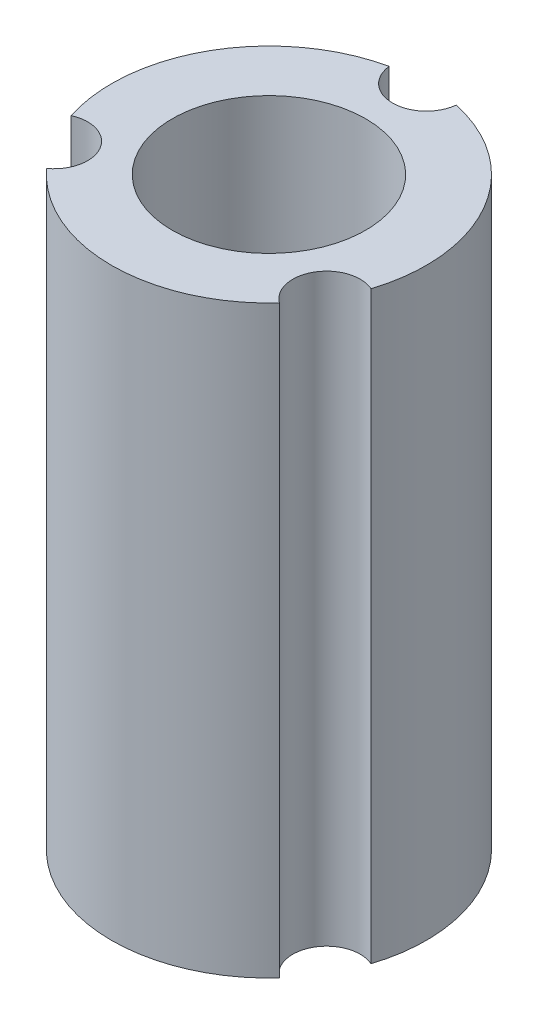
ISO-10303-21;
HEADER;
FILE_DESCRIPTION(('STEP AP214'),'2;1');
FILE_NAME('part.step','',(''),(''),'','','');
FILE_SCHEMA(('AUTOMOTIVE_DESIGN { 1 0 10303 214 1 1 1 1 }'));
ENDSEC;
DATA;
#1=APPLICATION_CONTEXT('core data for automotive mechanical design processes');
#2=APPLICATION_PROTOCOL_DEFINITION('international standard','automotive_design',2000,#1);
#3=PRODUCT_CONTEXT('',#1,'mechanical');
#4=PRODUCT('Part','Part','',(#3));
#5=PRODUCT_RELATED_PRODUCT_CATEGORY('part','',(#4));
#6=PRODUCT_DEFINITION_FORMATION('','',#4);
#7=PRODUCT_DEFINITION_CONTEXT('part definition',#1,'design');
#8=PRODUCT_DEFINITION('design','',#6,#7);
#9=PRODUCT_DEFINITION_SHAPE('','',#8);
#10=(LENGTH_UNIT() NAMED_UNIT(*) SI_UNIT(.MILLI.,.METRE.));
#11=(NAMED_UNIT(*) PLANE_ANGLE_UNIT() SI_UNIT($,.RADIAN.));
#12=(NAMED_UNIT(*) SI_UNIT($,.STERADIAN.) SOLID_ANGLE_UNIT());
#13=UNCERTAINTY_MEASURE_WITH_UNIT(LENGTH_MEASURE(1.E-05),#10,'distance_accuracy_value','');
#14=(GEOMETRIC_REPRESENTATION_CONTEXT(3) GLOBAL_UNCERTAINTY_ASSIGNED_CONTEXT((#13)) GLOBAL_UNIT_ASSIGNED_CONTEXT((#10,
#11,#12)) REPRESENTATION_CONTEXT('',''));
#15=CARTESIAN_POINT('',(0.,0.,0.));
#16=DIRECTION('',(0.,0.,1.));
#17=DIRECTION('',(1.,0.,0.));
#18=AXIS2_PLACEMENT_3D('',#15,#16,#17);
#19=CARTESIAN_POINT('',(0.,0.,0.));
#20=DIRECTION('',(0.,-1.,0.));
#21=DIRECTION('',(0.,0.,-1.));
#22=AXIS2_PLACEMENT_3D('',#19,#20,#21);
#23=CYLINDRICAL_SURFACE('',#22,3.);
#24=CARTESIAN_POINT('',(0.,6.,0.));
#25=DIRECTION('',(0.,-1.,0.));
#26=DIRECTION('',(0.,0.,-1.));
#27=AXIS2_PLACEMENT_3D('',#24,#25,#26);
#28=CIRCLE('',#27,3.);
#29=CARTESIAN_POINT('',(0.,6.,-3.));
#30=VERTEX_POINT('',#29);
#31=EDGE_CURVE('P0_E21',#30,#30,#28,.T.);
#32=ORIENTED_EDGE('',*,*,#31,.T.);
#33=EDGE_LOOP('',(#32));
#34=FACE_BOUND('',#33,.T.);
#35=CARTESIAN_POINT('',(0.,0.,0.));
#36=DIRECTION('',(0.,-1.,0.));
#37=DIRECTION('',(0.,0.,-1.));
#38=AXIS2_PLACEMENT_3D('',#35,#36,#37);
#39=CIRCLE('',#38,3.);
#40=CARTESIAN_POINT('',(0.,0.,-3.));
#41=VERTEX_POINT('',#40);
#42=EDGE_CURVE('P0_E11',#41,#41,#39,.F.);
#43=ORIENTED_EDGE('',*,*,#42,.T.);
#44=EDGE_LOOP('',(#43));
#45=FACE_BOUND('',#44,.T.);
#46=ADVANCED_FACE('P0_F17',(#34,#45),#23,.T.);
#47=CARTESIAN_POINT('',(0.,6.,0.));
#48=DIRECTION('',(0.,-1.,0.));
#49=DIRECTION('',(0.,0.,-1.));
#50=AXIS2_PLACEMENT_3D('',#47,#48,#49);
#51=PLANE('',#50);
#52=CARTESIAN_POINT('',(-2.625,6.,0.));
#53=CARTESIAN_POINT('',(-2.62479757037723,6.,0.500945811398764));
#54=CARTESIAN_POINT('',(-2.44069429028888,6.,0.966248612599916));
#55=CARTESIAN_POINT('',(-2.240871294793,6.,1.47128143713196));
#56=CARTESIAN_POINT('',(-1.85615530061469,6.,1.85615530061469));
#57=CARTESIAN_POINT('',(-1.47218434385404,6.,2.24028382095152));
#58=CARTESIAN_POINT('',(-0.966248612599916,6.,2.44069429028888));
#59=CARTESIAN_POINT('',(-0.501224965872504,6.,2.62489872879058));
#60=CARTESIAN_POINT('',(0.,6.,2.625));
#61=CARTESIAN_POINT('',(0.500178771877251,6.,2.62510105982863));
#62=CARTESIAN_POINT('',(0.966248612599916,6.,2.44069429028888));
#63=CARTESIAN_POINT('',(1.47128143713232,6.,2.24087129479286));
#64=CARTESIAN_POINT('',(1.85615530061469,6.,1.85615530061469));
#65=CARTESIAN_POINT('',(2.24028382095097,6.,1.47218434385437));
#66=CARTESIAN_POINT('',(2.44069429028888,6.,0.966248612599916));
#67=CARTESIAN_POINT('',(2.62479735415639,6.,0.501480885885279));
#68=CARTESIAN_POINT('',(2.625,6.,0.));
#69=B_SPLINE_CURVE_WITH_KNOTS('',2,(#52,#53,#54,#55,#56,#57,#58,#59,#60,#61,#62,#63,#64,#65,#66,
#67,#68),.UNSPECIFIED.,.F.,.F.,(3,2,2,2,2,2,2,2,3),(0.,0.125,0.25,0.375,0.5,0.625,0.75,0.875,
1.),.UNSPECIFIED.);
#70=CARTESIAN_POINT('',(-2.625,6.,0.));
#71=VERTEX_POINT('',#70);
#72=CARTESIAN_POINT('',(2.625,6.,0.));
#73=VERTEX_POINT('',#72);
#74=EDGE_CURVE('P0_E29',#71,#73,#69,.T.);
#75=ORIENTED_EDGE('',*,*,#74,.F.);
#76=CARTESIAN_POINT('',(2.625,6.,0.));
#77=CARTESIAN_POINT('',(2.62479757037723,6.,-0.500945811398764));
#78=CARTESIAN_POINT('',(2.44069429028888,6.,-0.966248612599916));
#79=CARTESIAN_POINT('',(2.240871294793,6.,-1.47128143713196));
#80=CARTESIAN_POINT('',(1.85615530061469,6.,-1.85615530061469));
#81=CARTESIAN_POINT('',(1.47218434385404,6.,-2.24028382095152));
#82=CARTESIAN_POINT('',(0.966248612599916,6.,-2.44069429028888));
#83=CARTESIAN_POINT('',(0.501224965872504,6.,-2.62489872879058));
#84=CARTESIAN_POINT('',(0.,6.,-2.625));
#85=CARTESIAN_POINT('',(-0.500178771877251,6.,-2.62510105982863));
#86=CARTESIAN_POINT('',(-0.966248612599916,6.,-2.44069429028888));
#87=CARTESIAN_POINT('',(-1.47128143713232,6.,-2.24087129479286));
#88=CARTESIAN_POINT('',(-1.85615530061469,6.,-1.85615530061469));
#89=CARTESIAN_POINT('',(-2.24028382095097,6.,-1.47218434385437));
#90=CARTESIAN_POINT('',(-2.44069429028888,6.,-0.966248612599916));
#91=CARTESIAN_POINT('',(-2.62479735415639,6.,-0.501480885885279));
#92=CARTESIAN_POINT('',(-2.625,6.,0.));
#93=B_SPLINE_CURVE_WITH_KNOTS('',2,(#76,#77,#78,#79,#80,#81,#82,#83,#84,#85,#86,#87,#88,#89,#90,
#91,#92),.UNSPECIFIED.,.F.,.F.,(3,2,2,2,2,2,2,2,3),(0.,0.125,0.25,0.375,0.5,0.625,0.75,0.875,
1.),.UNSPECIFIED.);
#94=EDGE_CURVE('P0_E34',#73,#71,#93,.T.);
#95=ORIENTED_EDGE('',*,*,#94,.F.);
#96=EDGE_LOOP('',(#75,#95));
#97=FACE_BOUND('',#96,.T.);
#98=ORIENTED_EDGE('',*,*,#31,.F.);
#99=EDGE_LOOP('',(#98));
#100=FACE_BOUND('',#99,.T.);
#101=ADVANCED_FACE('P0_F18',(#97,#100),#51,.F.);
#102=OPEN_SHELL('',(#46,#101));
#103=SHELL_BASED_SURFACE_MODEL('P0_B1',(#102));
#104=CARTESIAN_POINT('',(0.,26.,0.));
#105=DIRECTION('',(0.,1.,0.));
#106=DIRECTION('',(0.,0.,1.));
#107=AXIS2_PLACEMENT_3D('',#104,#105,#106);
#108=CYLINDRICAL_SURFACE('',#107,1.75);
#109=CARTESIAN_POINT('',(0.,6.,0.));
#110=DIRECTION('',(0.,1.,0.));
#111=DIRECTION('',(0.,0.,1.));
#112=AXIS2_PLACEMENT_3D('',#109,#110,#111);
#113=CIRCLE('',#112,1.75);
#114=CARTESIAN_POINT('',(0.,6.,1.75));
#115=VERTEX_POINT('',#114);
#116=EDGE_CURVE('P1_E103',#115,#115,#113,.T.);
#117=ORIENTED_EDGE('',*,*,#116,.F.);
#118=EDGE_LOOP('',(#117));
#119=FACE_BOUND('',#118,.T.);
#120=CARTESIAN_POINT('',(0.,8.5,0.));
#121=DIRECTION('',(0.,1.,0.));
#122=DIRECTION('',(0.,0.,1.));
#123=AXIS2_PLACEMENT_3D('',#120,#121,#122);
#124=CIRCLE('',#123,1.75);
#125=CARTESIAN_POINT('',(0.,8.5,1.75));
#126=VERTEX_POINT('',#125);
#127=EDGE_CURVE('P1_E20',#126,#126,#124,.T.);
#128=ORIENTED_EDGE('',*,*,#127,.T.);
#129=EDGE_LOOP('',(#128));
#130=FACE_BOUND('',#129,.T.);
#131=ADVANCED_FACE('P1_F17',(#119,#130),#108,.F.);
#132=CARTESIAN_POINT('',(0.,8.5,0.));
#133=DIRECTION('',(0.,-1.,0.));
#134=DIRECTION('',(0.,0.,-1.));
#135=AXIS2_PLACEMENT_3D('',#132,#133,#134);
#136=PLANE('',#135);
#137=ORIENTED_EDGE('',*,*,#127,.F.);
#138=EDGE_LOOP('',(#137));
#139=FACE_BOUND('',#138,.T.);
#140=CARTESIAN_POINT('',(0.,8.5,0.));
#141=DIRECTION('',(0.,-1.,0.));
#142=DIRECTION('',(0.,0.,-1.));
#143=AXIS2_PLACEMENT_3D('',#140,#141,#142);
#144=CIRCLE('',#143,4.3);
#145=CARTESIAN_POINT('',(0.,8.5,-4.3));
#146=VERTEX_POINT('',#145);
#147=EDGE_CURVE('P1_E78',#146,#146,#144,.F.);
#148=ORIENTED_EDGE('',*,*,#147,.T.);
#149=EDGE_LOOP('',(#148));
#150=FACE_BOUND('',#149,.T.);
#151=ADVANCED_FACE('P1_F111',(#139,#150),#136,.F.);
#152=CARTESIAN_POINT('',(0.,6.,0.));
#153=DIRECTION('',(0.,-1.,0.));
#154=DIRECTION('',(0.,0.,-1.));
#155=AXIS2_PLACEMENT_3D('',#152,#153,#154);
#156=PLANE('',#155);
#157=ORIENTED_EDGE('',*,*,#116,.T.);
#158=EDGE_LOOP('',(#157));
#159=FACE_BOUND('',#158,.T.);
#160=CARTESIAN_POINT('',(0.,6.,0.));
#161=DIRECTION('',(0.,-1.,0.));
#162=DIRECTION('',(0.,0.,-1.));
#163=AXIS2_PLACEMENT_3D('',#160,#161,#162);
#164=CIRCLE('',#163,2.625);
#165=CARTESIAN_POINT('',(0.,6.,-2.625));
#166=VERTEX_POINT('',#165);
#167=EDGE_CURVE('P1_E77',#166,#166,#164,.T.);
#168=ORIENTED_EDGE('',*,*,#167,.T.);
#169=EDGE_LOOP('',(#168));
#170=FACE_BOUND('',#169,.T.);
#171=ADVANCED_FACE('P1_F114',(#159,#170),#156,.T.);
#172=CARTESIAN_POINT('',(0.,26.,0.));
#173=DIRECTION('',(0.,-1.,0.));
#174=DIRECTION('',(0.,0.,-1.));
#175=AXIS2_PLACEMENT_3D('',#172,#173,#174);
#176=CYLINDRICAL_SURFACE('',#175,4.3);
#177=ORIENTED_EDGE('',*,*,#147,.F.);
#178=EDGE_LOOP('',(#177));
#179=FACE_BOUND('',#178,.T.);
#180=CARTESIAN_POINT('',(0.,26.,0.));
#181=DIRECTION('',(0.,-1.,0.));
#182=DIRECTION('',(0.,0.,-1.));
#183=AXIS2_PLACEMENT_3D('',#180,#181,#182);
#184=CIRCLE('',#183,4.3);
#185=CARTESIAN_POINT('',(0.,26.,-4.3));
#186=VERTEX_POINT('',#185);
#187=EDGE_CURVE('P1_E93',#186,#186,#184,.T.);
#188=ORIENTED_EDGE('',*,*,#187,.F.);
#189=EDGE_LOOP('',(#188));
#190=FACE_BOUND('',#189,.T.);
#191=ADVANCED_FACE('P1_F117',(#179,#190),#176,.F.);
#192=CARTESIAN_POINT('',(6.062177826491,-4.03,3.5));
#193=DIRECTION('',(0.,1.,0.));
#194=DIRECTION('',(0.,0.,1.));
#195=AXIS2_PLACEMENT_3D('',#192,#193,#194);
#196=CYLINDRICAL_SURFACE('',#195,1.5);
#197=DIRECTION('',(0.,1.,0.));
#198=VECTOR('',#197,1.);
#199=CARTESIAN_POINT('',(5.17731244514668,0.,4.71120322691871));
#200=LINE('',#199,#198);
#201=CARTESIAN_POINT('',(5.17731244514667,0.,4.71120322691872));
#202=VERTEX_POINT('',#201);
#203=CARTESIAN_POINT('',(5.17731244514667,26.,4.71120322691872));
#204=VERTEX_POINT('',#203);
#205=EDGE_CURVE('P1_E89',#202,#204,#200,.T.);
#206=ORIENTED_EDGE('',*,*,#205,.F.);
#207=CARTESIAN_POINT('',(6.062177826491,0.,3.5));
#208=DIRECTION('',(0.,1.,0.));
#209=DIRECTION('',(0.,0.,1.));
#210=AXIS2_PLACEMENT_3D('',#207,#208,#209);
#211=CIRCLE('',#210,1.5);
#212=CARTESIAN_POINT('',(6.66867789947615,0.,2.12808248736705));
#213=VERTEX_POINT('',#212);
#214=EDGE_CURVE('P1_E74',#202,#213,#211,.F.);
#215=ORIENTED_EDGE('',*,*,#214,.T.);
#216=DIRECTION('',(0.,1.,0.));
#217=VECTOR('',#216,1.);
#218=CARTESIAN_POINT('',(6.66867789947615,0.,2.12808248736705));
#219=LINE('',#218,#217);
#220=CARTESIAN_POINT('',(6.66867789947615,26.,2.12808248736704));
#221=VERTEX_POINT('',#220);
#222=EDGE_CURVE('P1_E67',#221,#213,#219,.F.);
#223=ORIENTED_EDGE('',*,*,#222,.F.);
#224=CARTESIAN_POINT('',(6.062177826491,26.,3.5));
#225=DIRECTION('',(0.,1.,0.));
#226=DIRECTION('',(0.,0.,1.));
#227=AXIS2_PLACEMENT_3D('',#224,#225,#226);
#228=CIRCLE('',#227,1.5);
#229=EDGE_CURVE('P1_E71',#204,#221,#228,.F.);
#230=ORIENTED_EDGE('',*,*,#229,.F.);
#231=EDGE_LOOP('',(#206,#215,#223,#230));
#232=FACE_BOUND('',#231,.T.);
#233=ADVANCED_FACE('P1_F69',(#232),#196,.F.);
#234=CARTESIAN_POINT('',(0.,0.,0.));
#235=DIRECTION('',(0.,1.,0.));
#236=DIRECTION('',(0.,0.,1.));
#237=AXIS2_PLACEMENT_3D('',#234,#235,#236);
#238=CYLINDRICAL_SURFACE('',#237,7.);
#239=CARTESIAN_POINT('',(0.,26.,0.));
#240=DIRECTION('',(0.,1.,0.));
#241=DIRECTION('',(0.,0.,1.));
#242=AXIS2_PLACEMENT_3D('',#239,#240,#241);
#243=CIRCLE('',#242,7.);
#244=CARTESIAN_POINT('',(1.49136545432948,26.,-6.83928571428583));
#245=VERTEX_POINT('',#244);
#246=EDGE_CURVE('P1_E82',#221,#245,#243,.T.);
#247=ORIENTED_EDGE('',*,*,#246,.F.);
#248=ORIENTED_EDGE('',*,*,#222,.T.);
#249=CARTESIAN_POINT('',(0.,0.,0.));
#250=DIRECTION('',(0.,1.,0.));
#251=DIRECTION('',(0.,0.,1.));
#252=AXIS2_PLACEMENT_3D('',#249,#250,#251);
#253=CIRCLE('',#252,7.);
#254=CARTESIAN_POINT('',(1.49136545432948,0.,-6.83928571428583));
#255=VERTEX_POINT('',#254);
#256=EDGE_CURVE('P1_E169',#213,#255,#253,.T.);
#257=ORIENTED_EDGE('',*,*,#256,.T.);
#258=DIRECTION('',(0.,1.,0.));
#259=VECTOR('',#258,1.);
#260=CARTESIAN_POINT('',(1.4913654543295,-4.03,-6.83928571428595));
#261=LINE('',#260,#259);
#262=EDGE_CURVE('P1_E85',#255,#245,#261,.T.);
#263=ORIENTED_EDGE('',*,*,#262,.T.);
#264=EDGE_LOOP('',(#247,#248,#257,#263));
#265=FACE_BOUND('',#264,.T.);
#266=ADVANCED_FACE('P1_F83',(#265),#238,.T.);
#267=CARTESIAN_POINT('',(0.,0.,0.));
#268=DIRECTION('',(0.,-1.,0.));
#269=DIRECTION('',(0.,0.,-1.));
#270=AXIS2_PLACEMENT_3D('',#267,#268,#269);
#271=CYLINDRICAL_SURFACE('',#270,2.625);
#272=ORIENTED_EDGE('',*,*,#167,.F.);
#273=EDGE_LOOP('',(#272));
#274=FACE_BOUND('',#273,.T.);
#275=CARTESIAN_POINT('',(0.,0.,0.));
#276=DIRECTION('',(0.,-1.,0.));
#277=DIRECTION('',(0.,0.,-1.));
#278=AXIS2_PLACEMENT_3D('',#275,#276,#277);
#279=CIRCLE('',#278,2.625);
#280=CARTESIAN_POINT('',(0.,0.,-2.625));
#281=VERTEX_POINT('',#280);
#282=EDGE_CURVE('P1_E156',#281,#281,#279,.T.);
#283=ORIENTED_EDGE('',*,*,#282,.T.);
#284=EDGE_LOOP('',(#283));
#285=FACE_BOUND('',#284,.T.);
#286=ADVANCED_FACE('P1_F135',(#274,#285),#271,.F.);
#287=CARTESIAN_POINT('',(0.,0.,0.));
#288=DIRECTION('',(0.,1.,0.));
#289=DIRECTION('',(0.,0.,1.));
#290=AXIS2_PLACEMENT_3D('',#287,#288,#289);
#291=CYLINDRICAL_SURFACE('',#290,7.);
#292=CARTESIAN_POINT('',(0.,0.,0.));
#293=DIRECTION('',(0.,1.,0.));
#294=DIRECTION('',(0.,0.,1.));
#295=AXIS2_PLACEMENT_3D('',#292,#293,#294);
#296=CIRCLE('',#295,7.);
#297=CARTESIAN_POINT('',(-5.17731244514684,0.,4.71120322691886));
#298=VERTEX_POINT('',#297);
#299=EDGE_CURVE('P1_E159',#298,#202,#296,.T.);
#300=ORIENTED_EDGE('',*,*,#299,.T.);
#301=ORIENTED_EDGE('',*,*,#205,.T.);
#302=CARTESIAN_POINT('',(0.,26.,0.));
#303=DIRECTION('',(0.,1.,0.));
#304=DIRECTION('',(0.,0.,1.));
#305=AXIS2_PLACEMENT_3D('',#302,#303,#304);
#306=CIRCLE('',#305,7.);
#307=CARTESIAN_POINT('',(-5.17731244514684,26.,4.71120322691886));
#308=VERTEX_POINT('',#307);
#309=EDGE_CURVE('P1_E88',#308,#204,#306,.T.);
#310=ORIENTED_EDGE('',*,*,#309,.F.);
#311=DIRECTION('',(0.,1.,0.));
#312=VECTOR('',#311,1.);
#313=CARTESIAN_POINT('',(-5.17731244514701,-4.03,4.71120322691898));
#314=LINE('',#313,#312);
#315=EDGE_CURVE('P1_E158',#308,#298,#314,.F.);
#316=ORIENTED_EDGE('',*,*,#315,.T.);
#317=EDGE_LOOP('',(#300,#301,#310,#316));
#318=FACE_BOUND('',#317,.T.);
#319=ADVANCED_FACE('P1_F125',(#318),#291,.T.);
#320=CARTESIAN_POINT('',(0.,26.,0.));
#321=DIRECTION('',(0.,1.,0.));
#322=DIRECTION('',(0.,0.,1.));
#323=AXIS2_PLACEMENT_3D('',#320,#321,#322);
#324=PLANE('',#323);
#325=ORIENTED_EDGE('',*,*,#187,.T.);
#326=EDGE_LOOP('',(#325));
#327=FACE_BOUND('',#326,.T.);
#328=ORIENTED_EDGE('',*,*,#309,.T.);
#329=ORIENTED_EDGE('',*,*,#229,.T.);
#330=ORIENTED_EDGE('',*,*,#246,.T.);
#331=CARTESIAN_POINT('',(0.,26.,-7.));
#332=DIRECTION('',(0.,1.,0.));
#333=DIRECTION('',(0.,0.,1.));
#334=AXIS2_PLACEMENT_3D('',#331,#332,#333);
#335=CIRCLE('',#334,1.5);
#336=CARTESIAN_POINT('',(-1.49136545432922,26.,-6.83928571428577));
#337=VERTEX_POINT('',#336);
#338=EDGE_CURVE('P1_E171',#245,#337,#335,.F.);
#339=ORIENTED_EDGE('',*,*,#338,.T.);
#340=CARTESIAN_POINT('',(0.,26.,0.));
#341=DIRECTION('',(0.,1.,0.));
#342=DIRECTION('',(0.,0.,1.));
#343=AXIS2_PLACEMENT_3D('',#340,#341,#342);
#344=CIRCLE('',#343,7.);
#345=CARTESIAN_POINT('',(-6.66867789947615,26.,2.12808248736704));
#346=VERTEX_POINT('',#345);
#347=EDGE_CURVE('P1_E179',#346,#337,#344,.F.);
#348=ORIENTED_EDGE('',*,*,#347,.F.);
#349=CARTESIAN_POINT('',(-6.062177826491,26.,3.5));
#350=DIRECTION('',(0.,1.,0.));
#351=DIRECTION('',(0.,0.,1.));
#352=AXIS2_PLACEMENT_3D('',#349,#350,#351);
#353=CIRCLE('',#352,1.5);
#354=EDGE_CURVE('P1_E181',#346,#308,#353,.F.);
#355=ORIENTED_EDGE('',*,*,#354,.T.);
#356=EDGE_LOOP('',(#328,#329,#330,#339,#348,#355));
#357=FACE_BOUND('',#356,.T.);
#358=ADVANCED_FACE('P1_F91',(#327,#357),#324,.T.);
#359=CARTESIAN_POINT('',(0.,-4.03,-7.));
#360=DIRECTION('',(0.,1.,0.));
#361=DIRECTION('',(0.,0.,1.));
#362=AXIS2_PLACEMENT_3D('',#359,#360,#361);
#363=CYLINDRICAL_SURFACE('',#362,1.5);
#364=ORIENTED_EDGE('',*,*,#262,.F.);
#365=CARTESIAN_POINT('',(0.,0.,-7.));
#366=DIRECTION('',(0.,1.,0.));
#367=DIRECTION('',(0.,0.,1.));
#368=AXIS2_PLACEMENT_3D('',#365,#366,#367);
#369=CIRCLE('',#368,1.5);
#370=CARTESIAN_POINT('',(-1.49136545432922,0.,-6.83928571428577));
#371=VERTEX_POINT('',#370);
#372=EDGE_CURVE('P1_E163',#255,#371,#369,.F.);
#373=ORIENTED_EDGE('',*,*,#372,.T.);
#374=DIRECTION('',(0.,1.,0.));
#375=VECTOR('',#374,1.);
#376=CARTESIAN_POINT('',(-1.49136545432896,0.,-6.83928571428583));
#377=LINE('',#376,#375);
#378=EDGE_CURVE('P1_E178',#337,#371,#377,.F.);
#379=ORIENTED_EDGE('',*,*,#378,.F.);
#380=ORIENTED_EDGE('',*,*,#338,.F.);
#381=EDGE_LOOP('',(#364,#373,#379,#380));
#382=FACE_BOUND('',#381,.T.);
#383=ADVANCED_FACE('P1_F124',(#382),#363,.F.);
#384=CARTESIAN_POINT('',(0.,0.,0.));
#385=DIRECTION('',(0.,1.,0.));
#386=DIRECTION('',(0.,0.,1.));
#387=AXIS2_PLACEMENT_3D('',#384,#385,#386);
#388=PLANE('',#387);
#389=ORIENTED_EDGE('',*,*,#282,.F.);
#390=EDGE_LOOP('',(#389));
#391=FACE_BOUND('',#390,.T.);
#392=CARTESIAN_POINT('',(-6.062177826491,0.,3.5));
#393=DIRECTION('',(0.,1.,0.));
#394=DIRECTION('',(0.,0.,1.));
#395=AXIS2_PLACEMENT_3D('',#392,#393,#394);
#396=CIRCLE('',#395,1.5);
#397=CARTESIAN_POINT('',(-6.66867789947615,0.,2.12808248736704));
#398=VERTEX_POINT('',#397);
#399=EDGE_CURVE('P1_E35',#298,#398,#396,.T.);
#400=ORIENTED_EDGE('',*,*,#399,.T.);
#401=CARTESIAN_POINT('',(0.,0.,0.));
#402=DIRECTION('',(0.,1.,0.));
#403=DIRECTION('',(0.,0.,1.));
#404=AXIS2_PLACEMENT_3D('',#401,#402,#403);
#405=CIRCLE('',#404,7.);
#406=EDGE_CURVE('P1_E26',#371,#398,#405,.T.);
#407=ORIENTED_EDGE('',*,*,#406,.F.);
#408=ORIENTED_EDGE('',*,*,#372,.F.);
#409=ORIENTED_EDGE('',*,*,#256,.F.);
#410=ORIENTED_EDGE('',*,*,#214,.F.);
#411=ORIENTED_EDGE('',*,*,#299,.F.);
#412=EDGE_LOOP('',(#400,#407,#408,#409,#410,#411));
#413=FACE_BOUND('',#412,.T.);
#414=ADVANCED_FACE('P1_F132',(#391,#413),#388,.F.);
#415=CARTESIAN_POINT('',(-6.062177826491,-4.03,3.5));
#416=DIRECTION('',(0.,1.,0.));
#417=DIRECTION('',(0.,0.,1.));
#418=AXIS2_PLACEMENT_3D('',#415,#416,#417);
#419=CYLINDRICAL_SURFACE('',#418,1.5);
#420=DIRECTION('',(0.,1.,0.));
#421=VECTOR('',#420,1.);
#422=CARTESIAN_POINT('',(-6.66867789947615,0.,2.12808248736705));
#423=LINE('',#422,#421);
#424=EDGE_CURVE('P1_E11',#398,#346,#423,.T.);
#425=ORIENTED_EDGE('',*,*,#424,.F.);
#426=ORIENTED_EDGE('',*,*,#399,.F.);
#427=ORIENTED_EDGE('',*,*,#315,.F.);
#428=ORIENTED_EDGE('',*,*,#354,.F.);
#429=EDGE_LOOP('',(#425,#426,#427,#428));
#430=FACE_BOUND('',#429,.T.);
#431=ADVANCED_FACE('P1_F140',(#430),#419,.F.);
#432=CARTESIAN_POINT('',(0.,0.,0.));
#433=DIRECTION('',(0.,1.,0.));
#434=DIRECTION('',(0.,0.,1.));
#435=AXIS2_PLACEMENT_3D('',#432,#433,#434);
#436=CYLINDRICAL_SURFACE('',#435,7.);
#437=ORIENTED_EDGE('',*,*,#406,.T.);
#438=ORIENTED_EDGE('',*,*,#424,.T.);
#439=ORIENTED_EDGE('',*,*,#347,.T.);
#440=ORIENTED_EDGE('',*,*,#378,.T.);
#441=EDGE_LOOP('',(#437,#438,#439,#440));
#442=FACE_BOUND('',#441,.T.);
#443=ADVANCED_FACE('P1_F138',(#442),#436,.T.);
#444=CLOSED_SHELL('',(#131,#151,#171,#191,#233,#266,#286,#319,#358,#383,#414,#431,#443));
#445=MANIFOLD_SOLID_BREP('P1_B1',#444);
#446=ADVANCED_BREP_SHAPE_REPRESENTATION('',(#18,#445),#14);
#447=MANIFOLD_SURFACE_SHAPE_REPRESENTATION('',(#18,#103),#14);
#448=SHAPE_REPRESENTATION('',(#18),#14);
#449=SHAPE_DEFINITION_REPRESENTATION(#9,#448);
#450=SHAPE_REPRESENTATION_RELATIONSHIP('','',#448,#446);
#451=SHAPE_REPRESENTATION_RELATIONSHIP('','',#448,#447);
ENDSEC;
END-ISO-10303-21;
